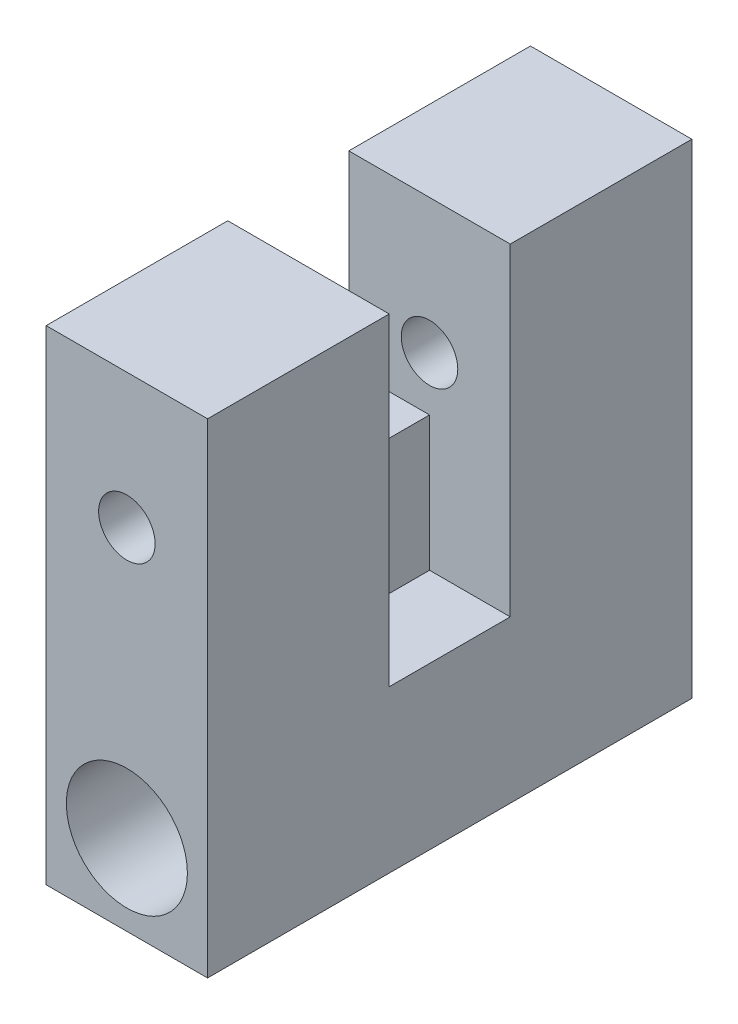
ISO-10303-21;
HEADER;
FILE_DESCRIPTION(('STEP AP214'),'2;1');
FILE_NAME('part.step','',(''),(''),'','','');
FILE_SCHEMA(('AUTOMOTIVE_DESIGN { 1 0 10303 214 1 1 1 1 }'));
ENDSEC;
DATA;
#1=APPLICATION_CONTEXT('core data for automotive mechanical design processes');
#2=APPLICATION_PROTOCOL_DEFINITION('international standard','automotive_design',2000,#1);
#3=PRODUCT_CONTEXT('',#1,'mechanical');
#4=PRODUCT('Part','Part','',(#3));
#5=PRODUCT_RELATED_PRODUCT_CATEGORY('part','',(#4));
#6=PRODUCT_DEFINITION_FORMATION('','',#4);
#7=PRODUCT_DEFINITION_CONTEXT('part definition',#1,'design');
#8=PRODUCT_DEFINITION('design','',#6,#7);
#9=PRODUCT_DEFINITION_SHAPE('','',#8);
#10=(LENGTH_UNIT() NAMED_UNIT(*) SI_UNIT(.MILLI.,.METRE.));
#11=(NAMED_UNIT(*) PLANE_ANGLE_UNIT() SI_UNIT($,.RADIAN.));
#12=(NAMED_UNIT(*) SI_UNIT($,.STERADIAN.) SOLID_ANGLE_UNIT());
#13=UNCERTAINTY_MEASURE_WITH_UNIT(LENGTH_MEASURE(1.E-05),#10,'distance_accuracy_value','');
#14=(GEOMETRIC_REPRESENTATION_CONTEXT(3) GLOBAL_UNCERTAINTY_ASSIGNED_CONTEXT((#13)) GLOBAL_UNIT_ASSIGNED_CONTEXT((#10,
#11,#12)) REPRESENTATION_CONTEXT('',''));
#15=CARTESIAN_POINT('',(0.,0.,0.));
#16=DIRECTION('',(0.,0.,1.));
#17=DIRECTION('',(1.,0.,0.));
#18=AXIS2_PLACEMENT_3D('',#15,#16,#17);
#19=CARTESIAN_POINT('',(-3.,9.,18.));
#20=DIRECTION('',(0.,-1.,0.));
#21=DIRECTION('',(0.,0.,-1.));
#22=AXIS2_PLACEMENT_3D('',#19,#20,#21);
#23=PLANE('',#22);
#24=DIRECTION('',(0.,0.,-1.));
#25=VECTOR('',#24,1.);
#26=CARTESIAN_POINT('',(-3.,9.,18.));
#27=LINE('',#26,#25);
#28=CARTESIAN_POINT('',(-3.,9.,6.75));
#29=VERTEX_POINT('',#28);
#30=CARTESIAN_POINT('',(-3.,9.,0.));
#31=VERTEX_POINT('',#30);
#32=EDGE_CURVE('E141',#29,#31,#27,.T.);
#33=ORIENTED_EDGE('',*,*,#32,.F.);
#34=DIRECTION('',(1.,0.,0.));
#35=VECTOR('',#34,1.);
#36=CARTESIAN_POINT('',(0.,9.,6.75));
#37=LINE('',#36,#35);
#38=CARTESIAN_POINT('',(3.,9.,6.75));
#39=VERTEX_POINT('',#38);
#40=EDGE_CURVE('E126',#29,#39,#37,.T.);
#41=ORIENTED_EDGE('',*,*,#40,.T.);
#42=DIRECTION('',(0.,0.,-1.));
#43=VECTOR('',#42,1.);
#44=CARTESIAN_POINT('',(3.,9.,18.));
#45=LINE('',#44,#43);
#46=CARTESIAN_POINT('',(3.,9.,0.));
#47=VERTEX_POINT('',#46);
#48=EDGE_CURVE('E42',#39,#47,#45,.T.);
#49=ORIENTED_EDGE('',*,*,#48,.T.);
#50=DIRECTION('',(-1.,0.,0.));
#51=VECTOR('',#50,1.);
#52=CARTESIAN_POINT('',(-3.,9.,0.));
#53=LINE('',#52,#51);
#54=EDGE_CURVE('E150',#47,#31,#53,.T.);
#55=ORIENTED_EDGE('',*,*,#54,.T.);
#56=EDGE_LOOP('',(#33,#41,#49,#55));
#57=FACE_BOUND('',#56,.T.);
#58=ADVANCED_FACE('F33',(#57),#23,.F.);
#59=CARTESIAN_POINT('',(0.,4.,0.));
#60=DIRECTION('',(0.,0.,1.));
#61=DIRECTION('',(1.,0.,0.));
#62=AXIS2_PLACEMENT_3D('',#59,#60,#61);
#63=CYLINDRICAL_SURFACE('',#62,1.05);
#64=CARTESIAN_POINT('',(0.,4.,0.));
#65=DIRECTION('',(0.,0.,1.));
#66=DIRECTION('',(1.,0.,0.));
#67=AXIS2_PLACEMENT_3D('',#64,#65,#66);
#68=CIRCLE('',#67,1.05);
#69=CARTESIAN_POINT('',(1.05,4.,0.));
#70=VERTEX_POINT('',#69);
#71=EDGE_CURVE('E193',#70,#70,#68,.T.);
#72=ORIENTED_EDGE('',*,*,#71,.F.);
#73=EDGE_LOOP('',(#72));
#74=FACE_BOUND('',#73,.T.);
#75=CARTESIAN_POINT('',(0.,4.,6.75));
#76=DIRECTION('',(0.,0.,-1.));
#77=DIRECTION('',(-1.,0.,0.));
#78=AXIS2_PLACEMENT_3D('',#75,#76,#77);
#79=CIRCLE('',#78,1.05);
#80=CARTESIAN_POINT('',(-1.05,4.,6.75));
#81=VERTEX_POINT('',#80);
#82=EDGE_CURVE('E181',#81,#81,#79,.T.);
#83=ORIENTED_EDGE('',*,*,#82,.F.);
#84=EDGE_LOOP('',(#83));
#85=FACE_BOUND('',#84,.T.);
#86=ADVANCED_FACE('F248',(#74,#85),#63,.F.);
#87=CARTESIAN_POINT('',(0.,0.,0.));
#88=DIRECTION('',(-1.,0.,0.));
#89=DIRECTION('',(0.,0.,1.));
#90=AXIS2_PLACEMENT_3D('',#87,#88,#89);
#91=PLANE('',#90);
#92=DIRECTION('',(0.,1.,0.));
#93=VECTOR('',#92,1.);
#94=CARTESIAN_POINT('',(0.,-3.,6.75));
#95=LINE('',#94,#93);
#96=CARTESIAN_POINT('',(0.,-3.,6.75));
#97=VERTEX_POINT('',#96);
#98=CARTESIAN_POINT('',(0.,2.,6.75));
#99=VERTEX_POINT('',#98);
#100=EDGE_CURVE('E176',#97,#99,#95,.T.);
#101=ORIENTED_EDGE('',*,*,#100,.T.);
#102=DIRECTION('',(0.,0.,1.));
#103=VECTOR('',#102,1.);
#104=CARTESIAN_POINT('',(0.,2.,0.));
#105=LINE('',#104,#103);
#106=CARTESIAN_POINT('',(0.,2.,11.25));
#107=VERTEX_POINT('',#106);
#108=EDGE_CURVE('E197',#99,#107,#105,.T.);
#109=ORIENTED_EDGE('',*,*,#108,.T.);
#110=DIRECTION('',(0.,-1.,0.));
#111=VECTOR('',#110,1.);
#112=CARTESIAN_POINT('',(0.,-3.,11.25));
#113=LINE('',#112,#111);
#114=CARTESIAN_POINT('',(0.,-3.,11.25));
#115=VERTEX_POINT('',#114);
#116=EDGE_CURVE('E184',#107,#115,#113,.T.);
#117=ORIENTED_EDGE('',*,*,#116,.T.);
#118=DIRECTION('',(0.,0.,-1.));
#119=VECTOR('',#118,1.);
#120=CARTESIAN_POINT('',(0.,-3.,11.25));
#121=LINE('',#120,#119);
#122=EDGE_CURVE('E168',#115,#97,#121,.T.);
#123=ORIENTED_EDGE('',*,*,#122,.T.);
#124=EDGE_LOOP('',(#101,#109,#117,#123));
#125=FACE_BOUND('',#124,.T.);
#126=ADVANCED_FACE('F215',(#125),#91,.F.);
#127=CARTESIAN_POINT('',(3.,-9.,18.));
#128=DIRECTION('',(-1.,0.,0.));
#129=DIRECTION('',(0.,0.,1.));
#130=AXIS2_PLACEMENT_3D('',#127,#128,#129);
#131=PLANE('',#130);
#132=ORIENTED_EDGE('',*,*,#48,.F.);
#133=DIRECTION('',(0.,1.,0.));
#134=VECTOR('',#133,1.);
#135=CARTESIAN_POINT('',(3.,-3.,6.75));
#136=LINE('',#135,#134);
#137=CARTESIAN_POINT('',(3.,-3.,6.75));
#138=VERTEX_POINT('',#137);
#139=EDGE_CURVE('E179',#138,#39,#136,.T.);
#140=ORIENTED_EDGE('',*,*,#139,.F.);
#141=DIRECTION('',(0.,0.,-1.));
#142=VECTOR('',#141,1.);
#143=CARTESIAN_POINT('',(3.,-3.,11.25));
#144=LINE('',#143,#142);
#145=CARTESIAN_POINT('',(3.,-3.,11.25));
#146=VERTEX_POINT('',#145);
#147=EDGE_CURVE('E173',#146,#138,#144,.T.);
#148=ORIENTED_EDGE('',*,*,#147,.F.);
#149=DIRECTION('',(0.,-1.,0.));
#150=VECTOR('',#149,1.);
#151=CARTESIAN_POINT('',(3.,-3.,11.25));
#152=LINE('',#151,#150);
#153=CARTESIAN_POINT('',(3.,9.,11.25));
#154=VERTEX_POINT('',#153);
#155=EDGE_CURVE('E177',#154,#146,#152,.T.);
#156=ORIENTED_EDGE('',*,*,#155,.F.);
#157=CARTESIAN_POINT('',(3.,9.,18.));
#158=VERTEX_POINT('',#157);
#159=EDGE_CURVE('E11',#158,#154,#45,.T.);
#160=ORIENTED_EDGE('',*,*,#159,.F.);
#161=DIRECTION('',(0.,1.,0.));
#162=VECTOR('',#161,1.);
#163=CARTESIAN_POINT('',(3.,-9.,18.));
#164=LINE('',#163,#162);
#165=CARTESIAN_POINT('',(3.,-9.,18.));
#166=VERTEX_POINT('',#165);
#167=EDGE_CURVE('E148',#166,#158,#164,.T.);
#168=ORIENTED_EDGE('',*,*,#167,.F.);
#169=DIRECTION('',(0.,0.,-1.));
#170=VECTOR('',#169,1.);
#171=CARTESIAN_POINT('',(3.,-9.,18.));
#172=LINE('',#171,#170);
#173=CARTESIAN_POINT('',(3.,-9.,0.));
#174=VERTEX_POINT('',#173);
#175=EDGE_CURVE('E145',#166,#174,#172,.T.);
#176=ORIENTED_EDGE('',*,*,#175,.T.);
#177=DIRECTION('',(0.,1.,0.));
#178=VECTOR('',#177,1.);
#179=CARTESIAN_POINT('',(3.,-9.,0.));
#180=LINE('',#179,#178);
#181=EDGE_CURVE('E153',#174,#47,#180,.T.);
#182=ORIENTED_EDGE('',*,*,#181,.T.);
#183=EDGE_LOOP('',(#132,#140,#148,#156,#160,#168,#176,#182));
#184=FACE_BOUND('',#183,.T.);
#185=ADVANCED_FACE('F35',(#184),#131,.F.);
#186=DIRECTION('',(1.,0.,0.));
#187=VECTOR('',#186,1.);
#188=CARTESIAN_POINT('',(0.,9.,11.25));
#189=LINE('',#188,#187);
#190=CARTESIAN_POINT('',(-3.,9.,11.25));
#191=VERTEX_POINT('',#190);
#192=EDGE_CURVE('E116',#191,#154,#189,.T.);
#193=ORIENTED_EDGE('',*,*,#192,.F.);
#194=CARTESIAN_POINT('',(-3.,9.,18.));
#195=VERTEX_POINT('',#194);
#196=EDGE_CURVE('E120',#195,#191,#27,.T.);
#197=ORIENTED_EDGE('',*,*,#196,.F.);
#198=DIRECTION('',(-1.,0.,0.));
#199=VECTOR('',#198,1.);
#200=CARTESIAN_POINT('',(-3.,9.,18.));
#201=LINE('',#200,#199);
#202=EDGE_CURVE('E80',#158,#195,#201,.T.);
#203=ORIENTED_EDGE('',*,*,#202,.F.);
#204=ORIENTED_EDGE('',*,*,#159,.T.);
#205=EDGE_LOOP('',(#193,#197,#203,#204));
#206=FACE_BOUND('',#205,.T.);
#207=ADVANCED_FACE('F118',(#206),#23,.F.);
#208=CARTESIAN_POINT('',(-3.,-9.,18.));
#209=DIRECTION('',(1.,0.,0.));
#210=DIRECTION('',(0.,0.,-1.));
#211=AXIS2_PLACEMENT_3D('',#208,#209,#210);
#212=PLANE('',#211);
#213=DIRECTION('',(0.,0.,-1.));
#214=VECTOR('',#213,1.);
#215=CARTESIAN_POINT('',(-3.,2.,18.));
#216=LINE('',#215,#214);
#217=CARTESIAN_POINT('',(-3.,2.,11.25));
#218=VERTEX_POINT('',#217);
#219=CARTESIAN_POINT('',(-3.,2.,6.75));
#220=VERTEX_POINT('',#219);
#221=EDGE_CURVE('E202',#218,#220,#216,.T.);
#222=ORIENTED_EDGE('',*,*,#221,.T.);
#223=DIRECTION('',(0.,1.,0.));
#224=VECTOR('',#223,1.);
#225=CARTESIAN_POINT('',(-3.,-8.99999999999999,6.75));
#226=LINE('',#225,#224);
#227=EDGE_CURVE('E136',#220,#29,#226,.T.);
#228=ORIENTED_EDGE('',*,*,#227,.T.);
#229=ORIENTED_EDGE('',*,*,#32,.T.);
#230=DIRECTION('',(0.,-1.,0.));
#231=VECTOR('',#230,1.);
#232=CARTESIAN_POINT('',(-3.,-9.,0.));
#233=LINE('',#232,#231);
#234=CARTESIAN_POINT('',(-3.,-9.,0.));
#235=VERTEX_POINT('',#234);
#236=EDGE_CURVE('E67',#31,#235,#233,.T.);
#237=ORIENTED_EDGE('',*,*,#236,.T.);
#238=DIRECTION('',(0.,0.,-1.));
#239=VECTOR('',#238,1.);
#240=CARTESIAN_POINT('',(-3.,-9.,18.));
#241=LINE('',#240,#239);
#242=CARTESIAN_POINT('',(-3.,-9.,18.));
#243=VERTEX_POINT('',#242);
#244=EDGE_CURVE('E142',#243,#235,#241,.T.);
#245=ORIENTED_EDGE('',*,*,#244,.F.);
#246=DIRECTION('',(0.,-1.,0.));
#247=VECTOR('',#246,1.);
#248=CARTESIAN_POINT('',(-3.,-9.,18.));
#249=LINE('',#248,#247);
#250=EDGE_CURVE('E140',#195,#243,#249,.T.);
#251=ORIENTED_EDGE('',*,*,#250,.F.);
#252=ORIENTED_EDGE('',*,*,#196,.T.);
#253=DIRECTION('',(0.,-1.,0.));
#254=VECTOR('',#253,1.);
#255=CARTESIAN_POINT('',(-3.,-9.,11.25));
#256=LINE('',#255,#254);
#257=EDGE_CURVE('E130',#191,#218,#256,.T.);
#258=ORIENTED_EDGE('',*,*,#257,.T.);
#259=EDGE_LOOP('',(#222,#228,#229,#237,#245,#251,#252,#258));
#260=FACE_BOUND('',#259,.T.);
#261=ADVANCED_FACE('F139',(#260),#212,.F.);
#262=CARTESIAN_POINT('',(-3.,-9.,18.));
#263=DIRECTION('',(0.,1.,0.));
#264=DIRECTION('',(0.,0.,1.));
#265=AXIS2_PLACEMENT_3D('',#262,#263,#264);
#266=PLANE('',#265);
#267=DIRECTION('',(1.,0.,0.));
#268=VECTOR('',#267,1.);
#269=CARTESIAN_POINT('',(-3.,-9.,0.));
#270=LINE('',#269,#268);
#271=EDGE_CURVE('E73',#235,#174,#270,.T.);
#272=ORIENTED_EDGE('',*,*,#271,.T.);
#273=ORIENTED_EDGE('',*,*,#175,.F.);
#274=DIRECTION('',(1.,0.,0.));
#275=VECTOR('',#274,1.);
#276=CARTESIAN_POINT('',(-3.,-9.,18.));
#277=LINE('',#276,#275);
#278=EDGE_CURVE('E50',#243,#166,#277,.T.);
#279=ORIENTED_EDGE('',*,*,#278,.F.);
#280=ORIENTED_EDGE('',*,*,#244,.T.);
#281=EDGE_LOOP('',(#272,#273,#279,#280));
#282=FACE_BOUND('',#281,.T.);
#283=ADVANCED_FACE('F242',(#282),#266,.F.);
#284=CARTESIAN_POINT('',(0.,0.,18.));
#285=DIRECTION('',(0.,0.,-1.));
#286=DIRECTION('',(-1.,0.,0.));
#287=AXIS2_PLACEMENT_3D('',#284,#285,#286);
#288=PLANE('',#287);
#289=CARTESIAN_POINT('',(0.,4.,18.));
#290=DIRECTION('',(0.,0.,1.));
#291=DIRECTION('',(1.,0.,0.));
#292=AXIS2_PLACEMENT_3D('',#289,#290,#291);
#293=CIRCLE('',#292,1.05);
#294=CARTESIAN_POINT('',(1.05,4.,18.));
#295=VERTEX_POINT('',#294);
#296=EDGE_CURVE('E194',#295,#295,#293,.T.);
#297=ORIENTED_EDGE('',*,*,#296,.F.);
#298=EDGE_LOOP('',(#297));
#299=FACE_BOUND('',#298,.T.);
#300=CARTESIAN_POINT('',(0.,-6.,18.));
#301=DIRECTION('',(0.,0.,1.));
#302=DIRECTION('',(1.,0.,0.));
#303=AXIS2_PLACEMENT_3D('',#300,#301,#302);
#304=CIRCLE('',#303,2.25);
#305=CARTESIAN_POINT('',(2.25,-6.,18.));
#306=VERTEX_POINT('',#305);
#307=EDGE_CURVE('E161',#306,#306,#304,.T.);
#308=ORIENTED_EDGE('',*,*,#307,.F.);
#309=EDGE_LOOP('',(#308));
#310=FACE_BOUND('',#309,.T.);
#311=ORIENTED_EDGE('',*,*,#167,.T.);
#312=ORIENTED_EDGE('',*,*,#202,.T.);
#313=ORIENTED_EDGE('',*,*,#250,.T.);
#314=ORIENTED_EDGE('',*,*,#278,.T.);
#315=EDGE_LOOP('',(#311,#312,#313,#314));
#316=FACE_BOUND('',#315,.T.);
#317=ADVANCED_FACE('F233',(#299,#310,#316),#288,.F.);
#318=CARTESIAN_POINT('',(0.,0.,0.));
#319=DIRECTION('',(0.,0.,-1.));
#320=DIRECTION('',(-1.,0.,0.));
#321=AXIS2_PLACEMENT_3D('',#318,#319,#320);
#322=PLANE('',#321);
#323=ORIENTED_EDGE('',*,*,#71,.T.);
#324=EDGE_LOOP('',(#323));
#325=FACE_BOUND('',#324,.T.);
#326=CARTESIAN_POINT('',(0.,-6.,0.));
#327=DIRECTION('',(0.,0.,1.));
#328=DIRECTION('',(1.,0.,0.));
#329=AXIS2_PLACEMENT_3D('',#326,#327,#328);
#330=CIRCLE('',#329,2.25);
#331=CARTESIAN_POINT('',(2.25,-6.,0.));
#332=VERTEX_POINT('',#331);
#333=EDGE_CURVE('E156',#332,#332,#330,.T.);
#334=ORIENTED_EDGE('',*,*,#333,.T.);
#335=EDGE_LOOP('',(#334));
#336=FACE_BOUND('',#335,.T.);
#337=ORIENTED_EDGE('',*,*,#181,.F.);
#338=ORIENTED_EDGE('',*,*,#271,.F.);
#339=ORIENTED_EDGE('',*,*,#236,.F.);
#340=ORIENTED_EDGE('',*,*,#54,.F.);
#341=EDGE_LOOP('',(#337,#338,#339,#340));
#342=FACE_BOUND('',#341,.T.);
#343=ADVANCED_FACE('F230',(#325,#336,#342),#322,.T.);
#344=CARTESIAN_POINT('',(0.,-6.,0.));
#345=DIRECTION('',(0.,0.,1.));
#346=DIRECTION('',(1.,0.,0.));
#347=AXIS2_PLACEMENT_3D('',#344,#345,#346);
#348=CYLINDRICAL_SURFACE('',#347,2.25);
#349=ORIENTED_EDGE('',*,*,#333,.F.);
#350=EDGE_LOOP('',(#349));
#351=FACE_BOUND('',#350,.T.);
#352=ORIENTED_EDGE('',*,*,#307,.T.);
#353=EDGE_LOOP('',(#352));
#354=FACE_BOUND('',#353,.T.);
#355=ADVANCED_FACE('F232',(#351,#354),#348,.F.);
#356=CARTESIAN_POINT('',(0.,-3.,6.75));
#357=DIRECTION('',(0.,0.,-1.));
#358=DIRECTION('',(-1.,0.,0.));
#359=AXIS2_PLACEMENT_3D('',#356,#357,#358);
#360=PLANE('',#359);
#361=DIRECTION('',(1.,0.,0.));
#362=VECTOR('',#361,1.);
#363=CARTESIAN_POINT('',(-7.,2.,6.75));
#364=LINE('',#363,#362);
#365=EDGE_CURVE('E137',#220,#99,#364,.T.);
#366=ORIENTED_EDGE('',*,*,#365,.T.);
#367=ORIENTED_EDGE('',*,*,#100,.F.);
#368=DIRECTION('',(1.,0.,0.));
#369=VECTOR('',#368,1.);
#370=CARTESIAN_POINT('',(0.,-3.,6.75));
#371=LINE('',#370,#369);
#372=EDGE_CURVE('E164',#97,#138,#371,.T.);
#373=ORIENTED_EDGE('',*,*,#372,.T.);
#374=ORIENTED_EDGE('',*,*,#139,.T.);
#375=ORIENTED_EDGE('',*,*,#40,.F.);
#376=ORIENTED_EDGE('',*,*,#227,.F.);
#377=EDGE_LOOP('',(#366,#367,#373,#374,#375,#376));
#378=FACE_BOUND('',#377,.T.);
#379=ORIENTED_EDGE('',*,*,#82,.T.);
#380=EDGE_LOOP('',(#379));
#381=FACE_BOUND('',#380,.T.);
#382=ADVANCED_FACE('F211',(#378,#381),#360,.F.);
#383=CARTESIAN_POINT('',(0.,-3.,11.25));
#384=DIRECTION('',(0.,-1.,0.));
#385=DIRECTION('',(0.,0.,-1.));
#386=AXIS2_PLACEMENT_3D('',#383,#384,#385);
#387=PLANE('',#386);
#388=ORIENTED_EDGE('',*,*,#147,.T.);
#389=ORIENTED_EDGE('',*,*,#372,.F.);
#390=ORIENTED_EDGE('',*,*,#122,.F.);
#391=DIRECTION('',(1.,0.,0.));
#392=VECTOR('',#391,1.);
#393=CARTESIAN_POINT('',(0.,-3.,11.25));
#394=LINE('',#393,#392);
#395=EDGE_CURVE('E125',#115,#146,#394,.T.);
#396=ORIENTED_EDGE('',*,*,#395,.T.);
#397=EDGE_LOOP('',(#388,#389,#390,#396));
#398=FACE_BOUND('',#397,.T.);
#399=ADVANCED_FACE('F219',(#398),#387,.F.);
#400=CARTESIAN_POINT('',(0.,-3.,11.25));
#401=DIRECTION('',(0.,0.,1.));
#402=DIRECTION('',(1.,0.,0.));
#403=AXIS2_PLACEMENT_3D('',#400,#401,#402);
#404=PLANE('',#403);
#405=ORIENTED_EDGE('',*,*,#116,.F.);
#406=DIRECTION('',(1.,0.,0.));
#407=VECTOR('',#406,1.);
#408=CARTESIAN_POINT('',(-7.,2.,11.25));
#409=LINE('',#408,#407);
#410=EDGE_CURVE('E134',#218,#107,#409,.T.);
#411=ORIENTED_EDGE('',*,*,#410,.F.);
#412=ORIENTED_EDGE('',*,*,#257,.F.);
#413=ORIENTED_EDGE('',*,*,#192,.T.);
#414=ORIENTED_EDGE('',*,*,#155,.T.);
#415=ORIENTED_EDGE('',*,*,#395,.F.);
#416=EDGE_LOOP('',(#405,#411,#412,#413,#414,#415));
#417=FACE_BOUND('',#416,.T.);
#418=CARTESIAN_POINT('',(0.,4.,11.25));
#419=DIRECTION('',(0.,0.,1.));
#420=DIRECTION('',(1.,0.,0.));
#421=AXIS2_PLACEMENT_3D('',#418,#419,#420);
#422=CIRCLE('',#421,1.05);
#423=CARTESIAN_POINT('',(1.05,4.,11.25));
#424=VERTEX_POINT('',#423);
#425=EDGE_CURVE('E190',#424,#424,#422,.T.);
#426=ORIENTED_EDGE('',*,*,#425,.T.);
#427=EDGE_LOOP('',(#426));
#428=FACE_BOUND('',#427,.T.);
#429=ADVANCED_FACE('F132',(#417,#428),#404,.F.);
#430=ORIENTED_EDGE('',*,*,#296,.T.);
#431=EDGE_LOOP('',(#430));
#432=FACE_BOUND('',#431,.T.);
#433=ORIENTED_EDGE('',*,*,#425,.F.);
#434=EDGE_LOOP('',(#433));
#435=FACE_BOUND('',#434,.T.);
#436=ADVANCED_FACE('F254',(#432,#435),#63,.F.);
#437=CARTESIAN_POINT('',(-7.,2.,6.75));
#438=DIRECTION('',(0.,-1.,0.));
#439=DIRECTION('',(0.,0.,-1.));
#440=AXIS2_PLACEMENT_3D('',#437,#438,#439);
#441=PLANE('',#440);
#442=ORIENTED_EDGE('',*,*,#365,.F.);
#443=ORIENTED_EDGE('',*,*,#221,.F.);
#444=ORIENTED_EDGE('',*,*,#410,.T.);
#445=ORIENTED_EDGE('',*,*,#108,.F.);
#446=EDGE_LOOP('',(#442,#443,#444,#445));
#447=FACE_BOUND('',#446,.T.);
#448=ADVANCED_FACE('F294',(#447),#441,.F.);
#449=CLOSED_SHELL('',(#58,#86,#126,#185,#207,#261,#283,#317,#343,#355,#382,#399,#429,#436,#448));
#450=MANIFOLD_SOLID_BREP('B2',#449);
#451=ADVANCED_BREP_SHAPE_REPRESENTATION('',(#18,#450),#14);
#452=SHAPE_DEFINITION_REPRESENTATION(#9,#451);
ENDSEC;
END-ISO-10303-21;
